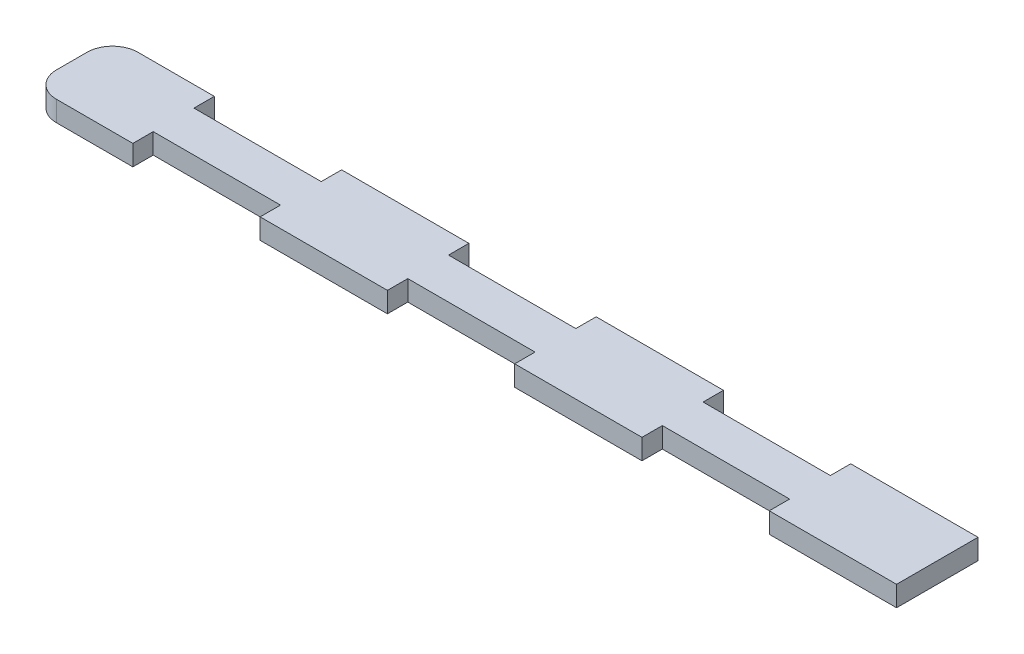
ISO-10303-21;
HEADER;
FILE_DESCRIPTION(('STEP AP214'),'2;1');
FILE_NAME('part.step','',(''),(''),'','','');
FILE_SCHEMA(('AUTOMOTIVE_DESIGN { 1 0 10303 214 1 1 1 1 }'));
ENDSEC;
DATA;
#1=APPLICATION_CONTEXT('core data for automotive mechanical design processes');
#2=APPLICATION_PROTOCOL_DEFINITION('international standard','automotive_design',2000,#1);
#3=PRODUCT_CONTEXT('',#1,'mechanical');
#4=PRODUCT('Part','Part','',(#3));
#5=PRODUCT_RELATED_PRODUCT_CATEGORY('part','',(#4));
#6=PRODUCT_DEFINITION_FORMATION('','',#4);
#7=PRODUCT_DEFINITION_CONTEXT('part definition',#1,'design');
#8=PRODUCT_DEFINITION('design','',#6,#7);
#9=PRODUCT_DEFINITION_SHAPE('','',#8);
#10=(LENGTH_UNIT() NAMED_UNIT(*) SI_UNIT(.MILLI.,.METRE.));
#11=(NAMED_UNIT(*) PLANE_ANGLE_UNIT() SI_UNIT($,.RADIAN.));
#12=(NAMED_UNIT(*) SI_UNIT($,.STERADIAN.) SOLID_ANGLE_UNIT());
#13=UNCERTAINTY_MEASURE_WITH_UNIT(LENGTH_MEASURE(1.E-05),#10,'distance_accuracy_value','');
#14=(GEOMETRIC_REPRESENTATION_CONTEXT(3) GLOBAL_UNCERTAINTY_ASSIGNED_CONTEXT((#13)) GLOBAL_UNIT_ASSIGNED_CONTEXT((#10,
#11,#12)) REPRESENTATION_CONTEXT('',''));
#15=CARTESIAN_POINT('',(0.,0.,0.));
#16=DIRECTION('',(0.,0.,1.));
#17=DIRECTION('',(1.,0.,0.));
#18=AXIS2_PLACEMENT_3D('',#15,#16,#17);
#19=CARTESIAN_POINT('',(-85.,2.,8.));
#20=DIRECTION('',(0.,0.,-1.));
#21=DIRECTION('',(-1.,0.,0.));
#22=AXIS2_PLACEMENT_3D('',#19,#20,#21);
#23=PLANE('',#22);
#24=DIRECTION('',(0.,1.,0.));
#25=VECTOR('',#24,1.);
#26=CARTESIAN_POINT('',(60.,-2.,8.));
#27=LINE('',#26,#25);
#28=CARTESIAN_POINT('',(60.,-2.,8.));
#29=VERTEX_POINT('',#28);
#30=CARTESIAN_POINT('',(60.,2.,8.));
#31=VERTEX_POINT('',#30);
#32=EDGE_CURVE('E277',#29,#31,#27,.T.);
#33=ORIENTED_EDGE('',*,*,#32,.F.);
#34=DIRECTION('',(1.,0.,0.));
#35=VECTOR('',#34,1.);
#36=CARTESIAN_POINT('',(-85.,-2.,8.));
#37=LINE('',#36,#35);
#38=CARTESIAN_POINT('',(85.,-2.,8.));
#39=VERTEX_POINT('',#38);
#40=EDGE_CURVE('E266',#29,#39,#37,.T.);
#41=ORIENTED_EDGE('',*,*,#40,.T.);
#42=DIRECTION('',(0.,-1.,0.));
#43=VECTOR('',#42,1.);
#44=CARTESIAN_POINT('',(85.,2.,8.));
#45=LINE('',#44,#43);
#46=CARTESIAN_POINT('',(85.,2.,8.));
#47=VERTEX_POINT('',#46);
#48=EDGE_CURVE('E425',#47,#39,#45,.T.);
#49=ORIENTED_EDGE('',*,*,#48,.F.);
#50=DIRECTION('',(1.,0.,0.));
#51=VECTOR('',#50,1.);
#52=CARTESIAN_POINT('',(-85.,2.,8.));
#53=LINE('',#52,#51);
#54=EDGE_CURVE('E422',#31,#47,#53,.T.);
#55=ORIENTED_EDGE('',*,*,#54,.F.);
#56=EDGE_LOOP('',(#33,#41,#49,#55));
#57=FACE_BOUND('',#56,.T.);
#58=ADVANCED_FACE('F42',(#57),#23,.F.);
#59=DIRECTION('',(0.,1.,0.));
#60=VECTOR('',#59,1.);
#61=CARTESIAN_POINT('',(35.,-2.,8.));
#62=LINE('',#61,#60);
#63=CARTESIAN_POINT('',(35.,-2.,8.));
#64=VERTEX_POINT('',#63);
#65=CARTESIAN_POINT('',(35.,2.,8.));
#66=VERTEX_POINT('',#65);
#67=EDGE_CURVE('E280',#64,#66,#62,.T.);
#68=ORIENTED_EDGE('',*,*,#67,.T.);
#69=CARTESIAN_POINT('',(10.,2.,7.99999999999965));
#70=VERTEX_POINT('',#69);
#71=EDGE_CURVE('E568',#70,#66,#53,.T.);
#72=ORIENTED_EDGE('',*,*,#71,.F.);
#73=DIRECTION('',(0.,1.,0.));
#74=VECTOR('',#73,1.);
#75=CARTESIAN_POINT('',(10.,-2.,7.99999999999965));
#76=LINE('',#75,#74);
#77=CARTESIAN_POINT('',(10.,-2.,7.99999999999965));
#78=VERTEX_POINT('',#77);
#79=EDGE_CURVE('E292',#78,#70,#76,.T.);
#80=ORIENTED_EDGE('',*,*,#79,.F.);
#81=EDGE_CURVE('E554',#78,#64,#37,.T.);
#82=ORIENTED_EDGE('',*,*,#81,.T.);
#83=EDGE_LOOP('',(#68,#72,#80,#82));
#84=FACE_BOUND('',#83,.T.);
#85=ADVANCED_FACE('F511',(#84),#23,.F.);
#86=DIRECTION('',(0.,1.,0.));
#87=VECTOR('',#86,1.);
#88=CARTESIAN_POINT('',(-15.,-2.,7.99999999999965));
#89=LINE('',#88,#87);
#90=CARTESIAN_POINT('',(-15.,-2.,7.99999999999965));
#91=VERTEX_POINT('',#90);
#92=CARTESIAN_POINT('',(-15.,2.,7.99999999999965));
#93=VERTEX_POINT('',#92);
#94=EDGE_CURVE('E275',#91,#93,#89,.T.);
#95=ORIENTED_EDGE('',*,*,#94,.T.);
#96=CARTESIAN_POINT('',(-40.,2.,7.9999999999993));
#97=VERTEX_POINT('',#96);
#98=EDGE_CURVE('E426',#97,#93,#53,.T.);
#99=ORIENTED_EDGE('',*,*,#98,.F.);
#100=DIRECTION('',(0.,1.,0.));
#101=VECTOR('',#100,1.);
#102=CARTESIAN_POINT('',(-40.,-2.,7.9999999999993));
#103=LINE('',#102,#101);
#104=CARTESIAN_POINT('',(-40.,-2.,7.9999999999993));
#105=VERTEX_POINT('',#104);
#106=EDGE_CURVE('E317',#105,#97,#103,.T.);
#107=ORIENTED_EDGE('',*,*,#106,.F.);
#108=EDGE_CURVE('E438',#105,#91,#37,.T.);
#109=ORIENTED_EDGE('',*,*,#108,.T.);
#110=EDGE_LOOP('',(#95,#99,#107,#109));
#111=FACE_BOUND('',#110,.T.);
#112=ADVANCED_FACE('F518',(#111),#23,.F.);
#113=CARTESIAN_POINT('',(-80.,2.,8.));
#114=VERTEX_POINT('',#113);
#115=CARTESIAN_POINT('',(-65.,2.,7.9999999999993));
#116=VERTEX_POINT('',#115);
#117=EDGE_CURVE('E423',#114,#116,#53,.T.);
#118=ORIENTED_EDGE('',*,*,#117,.F.);
#119=DIRECTION('',(0.,-1.,0.));
#120=VECTOR('',#119,1.);
#121=CARTESIAN_POINT('',(-80.,2.,8.));
#122=LINE('',#121,#120);
#123=CARTESIAN_POINT('',(-80.,-2.,8.));
#124=VERTEX_POINT('',#123);
#125=EDGE_CURVE('E11',#114,#124,#122,.T.);
#126=ORIENTED_EDGE('',*,*,#125,.T.);
#127=CARTESIAN_POINT('',(-65.,-2.,7.9999999999993));
#128=VERTEX_POINT('',#127);
#129=EDGE_CURVE('E415',#124,#128,#37,.T.);
#130=ORIENTED_EDGE('',*,*,#129,.T.);
#131=DIRECTION('',(0.,1.,0.));
#132=VECTOR('',#131,1.);
#133=CARTESIAN_POINT('',(-65.,-2.,7.9999999999993));
#134=LINE('',#133,#132);
#135=EDGE_CURVE('E297',#128,#116,#134,.T.);
#136=ORIENTED_EDGE('',*,*,#135,.T.);
#137=EDGE_LOOP('',(#118,#126,#130,#136));
#138=FACE_BOUND('',#137,.T.);
#139=ADVANCED_FACE('F514',(#138),#23,.F.);
#140=CARTESIAN_POINT('',(0.,2.,0.));
#141=DIRECTION('',(0.,-1.,0.));
#142=DIRECTION('',(0.,0.,-1.));
#143=AXIS2_PLACEMENT_3D('',#140,#141,#142);
#144=PLANE('',#143);
#145=DIRECTION('',(-1.,0.,0.));
#146=VECTOR('',#145,1.);
#147=CARTESIAN_POINT('',(-85.,2.,-8.));
#148=LINE('',#147,#146);
#149=CARTESIAN_POINT('',(-65.,2.,-7.9999999999993));
#150=VERTEX_POINT('',#149);
#151=CARTESIAN_POINT('',(-80.,2.,-8.));
#152=VERTEX_POINT('',#151);
#153=EDGE_CURVE('E414',#150,#152,#148,.T.);
#154=ORIENTED_EDGE('',*,*,#153,.T.);
#155=CARTESIAN_POINT('',(-80.,2.,-3.));
#156=DIRECTION('',(0.,-1.,0.));
#157=DIRECTION('',(0.,0.,-1.));
#158=AXIS2_PLACEMENT_3D('',#155,#156,#157);
#159=CIRCLE('',#158,5.);
#160=CARTESIAN_POINT('',(-85.,2.,-3.));
#161=VERTEX_POINT('',#160);
#162=EDGE_CURVE('E50',#152,#161,#159,.F.);
#163=ORIENTED_EDGE('',*,*,#162,.T.);
#164=DIRECTION('',(0.,0.,1.));
#165=VECTOR('',#164,1.);
#166=CARTESIAN_POINT('',(-85.,2.,8.));
#167=LINE('',#166,#165);
#168=CARTESIAN_POINT('',(-85.,2.,3.));
#169=VERTEX_POINT('',#168);
#170=EDGE_CURVE('E419',#161,#169,#167,.T.);
#171=ORIENTED_EDGE('',*,*,#170,.T.);
#172=CARTESIAN_POINT('',(-80.,2.,3.));
#173=DIRECTION('',(0.,-1.,0.));
#174=DIRECTION('',(0.,0.,-1.));
#175=AXIS2_PLACEMENT_3D('',#172,#173,#174);
#176=CIRCLE('',#175,5.);
#177=EDGE_CURVE('E57',#169,#114,#176,.F.);
#178=ORIENTED_EDGE('',*,*,#177,.T.);
#179=ORIENTED_EDGE('',*,*,#117,.T.);
#180=DIRECTION('',(0.,0.,-1.));
#181=VECTOR('',#180,1.);
#182=CARTESIAN_POINT('',(-65.,2.,7.9999999999993));
#183=LINE('',#182,#181);
#184=CARTESIAN_POINT('',(-65.,2.,3.9999999999993));
#185=VERTEX_POINT('',#184);
#186=EDGE_CURVE('E312',#116,#185,#183,.T.);
#187=ORIENTED_EDGE('',*,*,#186,.T.);
#188=DIRECTION('',(1.,0.,0.));
#189=VECTOR('',#188,1.);
#190=CARTESIAN_POINT('',(-40.,2.,3.9999999999993));
#191=LINE('',#190,#189);
#192=CARTESIAN_POINT('',(-40.,2.,3.9999999999993));
#193=VERTEX_POINT('',#192);
#194=EDGE_CURVE('E321',#185,#193,#191,.T.);
#195=ORIENTED_EDGE('',*,*,#194,.T.);
#196=DIRECTION('',(0.,0.,1.));
#197=VECTOR('',#196,1.);
#198=CARTESIAN_POINT('',(-40.,2.,7.9999999999993));
#199=LINE('',#198,#197);
#200=EDGE_CURVE('E318',#193,#97,#199,.T.);
#201=ORIENTED_EDGE('',*,*,#200,.T.);
#202=ORIENTED_EDGE('',*,*,#98,.T.);
#203=DIRECTION('',(0.,0.,-1.));
#204=VECTOR('',#203,1.);
#205=CARTESIAN_POINT('',(-15.,2.,7.99999999999965));
#206=LINE('',#205,#204);
#207=CARTESIAN_POINT('',(-15.,2.,3.99999999999965));
#208=VERTEX_POINT('',#207);
#209=EDGE_CURVE('E287',#93,#208,#206,.T.);
#210=ORIENTED_EDGE('',*,*,#209,.T.);
#211=DIRECTION('',(1.,0.,0.));
#212=VECTOR('',#211,1.);
#213=CARTESIAN_POINT('',(10.,2.,3.99999999999965));
#214=LINE('',#213,#212);
#215=CARTESIAN_POINT('',(10.,2.,3.99999999999965));
#216=VERTEX_POINT('',#215);
#217=EDGE_CURVE('E296',#208,#216,#214,.T.);
#218=ORIENTED_EDGE('',*,*,#217,.T.);
#219=DIRECTION('',(0.,0.,1.));
#220=VECTOR('',#219,1.);
#221=CARTESIAN_POINT('',(10.,2.,7.99999999999965));
#222=LINE('',#221,#220);
#223=EDGE_CURVE('E293',#216,#70,#222,.T.);
#224=ORIENTED_EDGE('',*,*,#223,.T.);
#225=ORIENTED_EDGE('',*,*,#71,.T.);
#226=DIRECTION('',(0.,0.,-1.));
#227=VECTOR('',#226,1.);
#228=CARTESIAN_POINT('',(35.,2.,8.));
#229=LINE('',#228,#227);
#230=CARTESIAN_POINT('',(35.,2.,4.));
#231=VERTEX_POINT('',#230);
#232=EDGE_CURVE('E267',#66,#231,#229,.T.);
#233=ORIENTED_EDGE('',*,*,#232,.T.);
#234=DIRECTION('',(1.,0.,0.));
#235=VECTOR('',#234,1.);
#236=CARTESIAN_POINT('',(60.,2.,4.));
#237=LINE('',#236,#235);
#238=CARTESIAN_POINT('',(60.,2.,4.));
#239=VERTEX_POINT('',#238);
#240=EDGE_CURVE('E270',#231,#239,#237,.T.);
#241=ORIENTED_EDGE('',*,*,#240,.T.);
#242=DIRECTION('',(0.,0.,1.));
#243=VECTOR('',#242,1.);
#244=CARTESIAN_POINT('',(60.,2.,8.));
#245=LINE('',#244,#243);
#246=EDGE_CURVE('E259',#239,#31,#245,.T.);
#247=ORIENTED_EDGE('',*,*,#246,.T.);
#248=ORIENTED_EDGE('',*,*,#54,.T.);
#249=DIRECTION('',(0.,0.,-1.));
#250=VECTOR('',#249,1.);
#251=CARTESIAN_POINT('',(85.,2.,8.));
#252=LINE('',#251,#250);
#253=CARTESIAN_POINT('',(85.,2.,-8.));
#254=VERTEX_POINT('',#253);
#255=EDGE_CURVE('E411',#47,#254,#252,.T.);
#256=ORIENTED_EDGE('',*,*,#255,.T.);
#257=CARTESIAN_POINT('',(60.,2.,-8.));
#258=VERTEX_POINT('',#257);
#259=EDGE_CURVE('E416',#254,#258,#148,.T.);
#260=ORIENTED_EDGE('',*,*,#259,.T.);
#261=DIRECTION('',(0.,0.,-1.));
#262=VECTOR('',#261,1.);
#263=CARTESIAN_POINT('',(60.,2.,-8.));
#264=LINE('',#263,#262);
#265=CARTESIAN_POINT('',(60.,2.,-4.));
#266=VERTEX_POINT('',#265);
#267=EDGE_CURVE('E344',#266,#258,#264,.T.);
#268=ORIENTED_EDGE('',*,*,#267,.F.);
#269=DIRECTION('',(1.,0.,0.));
#270=VECTOR('',#269,1.);
#271=CARTESIAN_POINT('',(60.,2.,-4.));
#272=LINE('',#271,#270);
#273=CARTESIAN_POINT('',(35.,2.,-4.));
#274=VERTEX_POINT('',#273);
#275=EDGE_CURVE('E337',#274,#266,#272,.T.);
#276=ORIENTED_EDGE('',*,*,#275,.F.);
#277=DIRECTION('',(0.,0.,1.));
#278=VECTOR('',#277,1.);
#279=CARTESIAN_POINT('',(35.,2.,-8.));
#280=LINE('',#279,#278);
#281=CARTESIAN_POINT('',(35.,2.,-8.));
#282=VERTEX_POINT('',#281);
#283=EDGE_CURVE('E346',#282,#274,#280,.T.);
#284=ORIENTED_EDGE('',*,*,#283,.F.);
#285=CARTESIAN_POINT('',(10.,2.,-7.99999999999965));
#286=VERTEX_POINT('',#285);
#287=EDGE_CURVE('E420',#282,#286,#148,.T.);
#288=ORIENTED_EDGE('',*,*,#287,.T.);
#289=DIRECTION('',(0.,0.,-1.));
#290=VECTOR('',#289,1.);
#291=CARTESIAN_POINT('',(10.,2.,-7.99999999999965));
#292=LINE('',#291,#290);
#293=CARTESIAN_POINT('',(10.,2.,-3.99999999999965));
#294=VERTEX_POINT('',#293);
#295=EDGE_CURVE('E372',#294,#286,#292,.T.);
#296=ORIENTED_EDGE('',*,*,#295,.F.);
#297=DIRECTION('',(1.,0.,0.));
#298=VECTOR('',#297,1.);
#299=CARTESIAN_POINT('',(10.,2.,-3.99999999999965));
#300=LINE('',#299,#298);
#301=CARTESIAN_POINT('',(-15.,2.,-3.99999999999965));
#302=VERTEX_POINT('',#301);
#303=EDGE_CURVE('E374',#302,#294,#300,.T.);
#304=ORIENTED_EDGE('',*,*,#303,.F.);
#305=DIRECTION('',(0.,0.,1.));
#306=VECTOR('',#305,1.);
#307=CARTESIAN_POINT('',(-15.,2.,-7.99999999999965));
#308=LINE('',#307,#306);
#309=CARTESIAN_POINT('',(-15.,2.,-7.99999999999965));
#310=VERTEX_POINT('',#309);
#311=EDGE_CURVE('E347',#310,#302,#308,.T.);
#312=ORIENTED_EDGE('',*,*,#311,.F.);
#313=CARTESIAN_POINT('',(-40.,2.,-7.9999999999993));
#314=VERTEX_POINT('',#313);
#315=EDGE_CURVE('E487',#310,#314,#148,.T.);
#316=ORIENTED_EDGE('',*,*,#315,.T.);
#317=DIRECTION('',(0.,0.,-1.));
#318=VECTOR('',#317,1.);
#319=CARTESIAN_POINT('',(-40.,2.,-7.9999999999993));
#320=LINE('',#319,#318);
#321=CARTESIAN_POINT('',(-40.,2.,-3.9999999999993));
#322=VERTEX_POINT('',#321);
#323=EDGE_CURVE('E396',#322,#314,#320,.T.);
#324=ORIENTED_EDGE('',*,*,#323,.F.);
#325=DIRECTION('',(1.,0.,0.));
#326=VECTOR('',#325,1.);
#327=CARTESIAN_POINT('',(-40.,2.,-3.9999999999993));
#328=LINE('',#327,#326);
#329=CARTESIAN_POINT('',(-65.,2.,-3.9999999999993));
#330=VERTEX_POINT('',#329);
#331=EDGE_CURVE('E398',#330,#322,#328,.T.);
#332=ORIENTED_EDGE('',*,*,#331,.F.);
#333=DIRECTION('',(0.,0.,1.));
#334=VECTOR('',#333,1.);
#335=CARTESIAN_POINT('',(-65.,2.,-7.9999999999993));
#336=LINE('',#335,#334);
#337=EDGE_CURVE('E371',#150,#330,#336,.T.);
#338=ORIENTED_EDGE('',*,*,#337,.F.);
#339=EDGE_LOOP('',(#154,#163,#171,#178,#179,#187,#195,#201,#202,#210,#218,#224,#225,#233,#241,
#247,#248,#256,#260,#268,#276,#284,#288,#296,#304,#312,#316,#324,#332,#338));
#340=FACE_BOUND('',#339,.T.);
#341=ADVANCED_FACE('F456',(#340),#144,.F.);
#342=CARTESIAN_POINT('',(0.,-2.,0.));
#343=DIRECTION('',(0.,-1.,0.));
#344=DIRECTION('',(0.,0.,-1.));
#345=AXIS2_PLACEMENT_3D('',#342,#343,#344);
#346=PLANE('',#345);
#347=DIRECTION('',(0.,0.,1.));
#348=VECTOR('',#347,1.);
#349=CARTESIAN_POINT('',(-85.,-2.,8.));
#350=LINE('',#349,#348);
#351=CARTESIAN_POINT('',(-85.,-2.,-3.));
#352=VERTEX_POINT('',#351);
#353=CARTESIAN_POINT('',(-85.,-2.,3.));
#354=VERTEX_POINT('',#353);
#355=EDGE_CURVE('E433',#352,#354,#350,.T.);
#356=ORIENTED_EDGE('',*,*,#355,.F.);
#357=CARTESIAN_POINT('',(-80.,-2.,-3.));
#358=DIRECTION('',(0.,-1.,0.));
#359=DIRECTION('',(0.,0.,-1.));
#360=AXIS2_PLACEMENT_3D('',#357,#358,#359);
#361=CIRCLE('',#360,5.);
#362=CARTESIAN_POINT('',(-80.,-2.,-8.));
#363=VERTEX_POINT('',#362);
#364=EDGE_CURVE('E451',#352,#363,#361,.T.);
#365=ORIENTED_EDGE('',*,*,#364,.T.);
#366=DIRECTION('',(-1.,0.,0.));
#367=VECTOR('',#366,1.);
#368=CARTESIAN_POINT('',(-85.,-2.,-8.));
#369=LINE('',#368,#367);
#370=CARTESIAN_POINT('',(-65.,-2.,-7.9999999999993));
#371=VERTEX_POINT('',#370);
#372=EDGE_CURVE('E429',#371,#363,#369,.T.);
#373=ORIENTED_EDGE('',*,*,#372,.F.);
#374=DIRECTION('',(0.,0.,1.));
#375=VECTOR('',#374,1.);
#376=CARTESIAN_POINT('',(-65.,-2.,-7.9999999999993));
#377=LINE('',#376,#375);
#378=CARTESIAN_POINT('',(-65.,-2.,-3.9999999999993));
#379=VERTEX_POINT('',#378);
#380=EDGE_CURVE('E399',#371,#379,#377,.T.);
#381=ORIENTED_EDGE('',*,*,#380,.T.);
#382=DIRECTION('',(1.,0.,0.));
#383=VECTOR('',#382,1.);
#384=CARTESIAN_POINT('',(-40.,-2.,-3.9999999999993));
#385=LINE('',#384,#383);
#386=CARTESIAN_POINT('',(-40.,-2.,-3.9999999999993));
#387=VERTEX_POINT('',#386);
#388=EDGE_CURVE('E406',#379,#387,#385,.T.);
#389=ORIENTED_EDGE('',*,*,#388,.T.);
#390=DIRECTION('',(0.,0.,-1.));
#391=VECTOR('',#390,1.);
#392=CARTESIAN_POINT('',(-40.,-2.,-7.9999999999993));
#393=LINE('',#392,#391);
#394=CARTESIAN_POINT('',(-40.,-2.,-7.9999999999993));
#395=VERTEX_POINT('',#394);
#396=EDGE_CURVE('E389',#387,#395,#393,.T.);
#397=ORIENTED_EDGE('',*,*,#396,.T.);
#398=CARTESIAN_POINT('',(-15.,-2.,-7.99999999999965));
#399=VERTEX_POINT('',#398);
#400=EDGE_CURVE('E467',#399,#395,#369,.T.);
#401=ORIENTED_EDGE('',*,*,#400,.F.);
#402=DIRECTION('',(0.,0.,1.));
#403=VECTOR('',#402,1.);
#404=CARTESIAN_POINT('',(-15.,-2.,-7.99999999999965));
#405=LINE('',#404,#403);
#406=CARTESIAN_POINT('',(-15.,-2.,-3.99999999999965));
#407=VERTEX_POINT('',#406);
#408=EDGE_CURVE('E375',#399,#407,#405,.T.);
#409=ORIENTED_EDGE('',*,*,#408,.T.);
#410=DIRECTION('',(1.,0.,0.));
#411=VECTOR('',#410,1.);
#412=CARTESIAN_POINT('',(10.,-2.,-3.99999999999965));
#413=LINE('',#412,#411);
#414=CARTESIAN_POINT('',(10.,-2.,-3.99999999999965));
#415=VERTEX_POINT('',#414);
#416=EDGE_CURVE('E382',#407,#415,#413,.T.);
#417=ORIENTED_EDGE('',*,*,#416,.T.);
#418=DIRECTION('',(0.,0.,-1.));
#419=VECTOR('',#418,1.);
#420=CARTESIAN_POINT('',(10.,-2.,-7.99999999999965));
#421=LINE('',#420,#419);
#422=CARTESIAN_POINT('',(10.,-2.,-7.99999999999965));
#423=VERTEX_POINT('',#422);
#424=EDGE_CURVE('E363',#415,#423,#421,.T.);
#425=ORIENTED_EDGE('',*,*,#424,.T.);
#426=CARTESIAN_POINT('',(35.,-2.,-8.));
#427=VERTEX_POINT('',#426);
#428=EDGE_CURVE('E434',#427,#423,#369,.T.);
#429=ORIENTED_EDGE('',*,*,#428,.F.);
#430=DIRECTION('',(0.,0.,1.));
#431=VECTOR('',#430,1.);
#432=CARTESIAN_POINT('',(35.,-2.,-8.));
#433=LINE('',#432,#431);
#434=CARTESIAN_POINT('',(35.,-2.,-4.));
#435=VERTEX_POINT('',#434);
#436=EDGE_CURVE('E336',#427,#435,#433,.T.);
#437=ORIENTED_EDGE('',*,*,#436,.T.);
#438=DIRECTION('',(1.,0.,0.));
#439=VECTOR('',#438,1.);
#440=CARTESIAN_POINT('',(60.,-2.,-4.));
#441=LINE('',#440,#439);
#442=CARTESIAN_POINT('',(60.,-2.,-4.));
#443=VERTEX_POINT('',#442);
#444=EDGE_CURVE('E340',#435,#443,#441,.T.);
#445=ORIENTED_EDGE('',*,*,#444,.T.);
#446=DIRECTION('',(0.,0.,-1.));
#447=VECTOR('',#446,1.);
#448=CARTESIAN_POINT('',(60.,-2.,-8.));
#449=LINE('',#448,#447);
#450=CARTESIAN_POINT('',(60.,-2.,-8.));
#451=VERTEX_POINT('',#450);
#452=EDGE_CURVE('E333',#443,#451,#449,.T.);
#453=ORIENTED_EDGE('',*,*,#452,.T.);
#454=CARTESIAN_POINT('',(85.,-2.,-8.));
#455=VERTEX_POINT('',#454);
#456=EDGE_CURVE('E430',#455,#451,#369,.T.);
#457=ORIENTED_EDGE('',*,*,#456,.F.);
#458=DIRECTION('',(0.,0.,-1.));
#459=VECTOR('',#458,1.);
#460=CARTESIAN_POINT('',(85.,-2.,8.));
#461=LINE('',#460,#459);
#462=EDGE_CURVE('E354',#39,#455,#461,.T.);
#463=ORIENTED_EDGE('',*,*,#462,.F.);
#464=ORIENTED_EDGE('',*,*,#40,.F.);
#465=DIRECTION('',(0.,0.,1.));
#466=VECTOR('',#465,1.);
#467=CARTESIAN_POINT('',(60.,-2.,8.));
#468=LINE('',#467,#466);
#469=CARTESIAN_POINT('',(60.,-2.,4.));
#470=VERTEX_POINT('',#469);
#471=EDGE_CURVE('E253',#470,#29,#468,.T.);
#472=ORIENTED_EDGE('',*,*,#471,.F.);
#473=DIRECTION('',(1.,0.,0.));
#474=VECTOR('',#473,1.);
#475=CARTESIAN_POINT('',(60.,-2.,4.));
#476=LINE('',#475,#474);
#477=CARTESIAN_POINT('',(35.,-2.,4.));
#478=VERTEX_POINT('',#477);
#479=EDGE_CURVE('E241',#478,#470,#476,.T.);
#480=ORIENTED_EDGE('',*,*,#479,.F.);
#481=DIRECTION('',(0.,0.,-1.));
#482=VECTOR('',#481,1.);
#483=CARTESIAN_POINT('',(35.,-2.,8.));
#484=LINE('',#483,#482);
#485=EDGE_CURVE('E252',#64,#478,#484,.T.);
#486=ORIENTED_EDGE('',*,*,#485,.F.);
#487=ORIENTED_EDGE('',*,*,#81,.F.);
#488=DIRECTION('',(0.,0.,1.));
#489=VECTOR('',#488,1.);
#490=CARTESIAN_POINT('',(10.,-2.,7.99999999999965));
#491=LINE('',#490,#489);
#492=CARTESIAN_POINT('',(10.,-2.,3.99999999999965));
#493=VERTEX_POINT('',#492);
#494=EDGE_CURVE('E284',#493,#78,#491,.T.);
#495=ORIENTED_EDGE('',*,*,#494,.F.);
#496=DIRECTION('',(1.,0.,0.));
#497=VECTOR('',#496,1.);
#498=CARTESIAN_POINT('',(10.,-2.,3.99999999999965));
#499=LINE('',#498,#497);
#500=CARTESIAN_POINT('',(-15.,-2.,3.99999999999965));
#501=VERTEX_POINT('',#500);
#502=EDGE_CURVE('E286',#501,#493,#499,.T.);
#503=ORIENTED_EDGE('',*,*,#502,.F.);
#504=DIRECTION('',(0.,0.,-1.));
#505=VECTOR('',#504,1.);
#506=CARTESIAN_POINT('',(-15.,-2.,7.99999999999965));
#507=LINE('',#506,#505);
#508=EDGE_CURVE('E290',#91,#501,#507,.T.);
#509=ORIENTED_EDGE('',*,*,#508,.F.);
#510=ORIENTED_EDGE('',*,*,#108,.F.);
#511=DIRECTION('',(0.,0.,1.));
#512=VECTOR('',#511,1.);
#513=CARTESIAN_POINT('',(-40.,-2.,7.9999999999993));
#514=LINE('',#513,#512);
#515=CARTESIAN_POINT('',(-40.,-2.,3.9999999999993));
#516=VERTEX_POINT('',#515);
#517=EDGE_CURVE('E309',#516,#105,#514,.T.);
#518=ORIENTED_EDGE('',*,*,#517,.F.);
#519=DIRECTION('',(1.,0.,0.));
#520=VECTOR('',#519,1.);
#521=CARTESIAN_POINT('',(-40.,-2.,3.9999999999993));
#522=LINE('',#521,#520);
#523=CARTESIAN_POINT('',(-65.,-2.,3.9999999999993));
#524=VERTEX_POINT('',#523);
#525=EDGE_CURVE('E311',#524,#516,#522,.T.);
#526=ORIENTED_EDGE('',*,*,#525,.F.);
#527=DIRECTION('',(0.,0.,-1.));
#528=VECTOR('',#527,1.);
#529=CARTESIAN_POINT('',(-65.,-2.,7.9999999999993));
#530=LINE('',#529,#528);
#531=EDGE_CURVE('E315',#128,#524,#530,.T.);
#532=ORIENTED_EDGE('',*,*,#531,.F.);
#533=ORIENTED_EDGE('',*,*,#129,.F.);
#534=CARTESIAN_POINT('',(-80.,-2.,3.));
#535=DIRECTION('',(0.,-1.,0.));
#536=DIRECTION('',(0.,0.,-1.));
#537=AXIS2_PLACEMENT_3D('',#534,#535,#536);
#538=CIRCLE('',#537,5.);
#539=EDGE_CURVE('E449',#124,#354,#538,.T.);
#540=ORIENTED_EDGE('',*,*,#539,.T.);
#541=EDGE_LOOP('',(#356,#365,#373,#381,#389,#397,#401,#409,#417,#425,#429,#437,#445,#453,#457,
#463,#464,#472,#480,#486,#487,#495,#503,#509,#510,#518,#526,#532,#533,#540));
#542=FACE_BOUND('',#541,.T.);
#543=ADVANCED_FACE('F264',(#542),#346,.T.);
#544=CARTESIAN_POINT('',(-85.,2.,-8.));
#545=DIRECTION('',(0.,0.,1.));
#546=DIRECTION('',(1.,0.,0.));
#547=AXIS2_PLACEMENT_3D('',#544,#545,#546);
#548=PLANE('',#547);
#549=ORIENTED_EDGE('',*,*,#456,.T.);
#550=DIRECTION('',(0.,1.,0.));
#551=VECTOR('',#550,1.);
#552=CARTESIAN_POINT('',(60.,-2.,-8.));
#553=LINE('',#552,#551);
#554=EDGE_CURVE('E343',#451,#258,#553,.T.);
#555=ORIENTED_EDGE('',*,*,#554,.T.);
#556=ORIENTED_EDGE('',*,*,#259,.F.);
#557=DIRECTION('',(0.,-1.,0.));
#558=VECTOR('',#557,1.);
#559=CARTESIAN_POINT('',(85.,2.,-8.));
#560=LINE('',#559,#558);
#561=EDGE_CURVE('E441',#254,#455,#560,.T.);
#562=ORIENTED_EDGE('',*,*,#561,.T.);
#563=EDGE_LOOP('',(#549,#555,#556,#562));
#564=FACE_BOUND('',#563,.T.);
#565=ADVANCED_FACE('F566',(#564),#548,.F.);
#566=ORIENTED_EDGE('',*,*,#287,.F.);
#567=DIRECTION('',(0.,1.,0.));
#568=VECTOR('',#567,1.);
#569=CARTESIAN_POINT('',(35.,-2.,-8.));
#570=LINE('',#569,#568);
#571=EDGE_CURVE('E357',#427,#282,#570,.T.);
#572=ORIENTED_EDGE('',*,*,#571,.F.);
#573=ORIENTED_EDGE('',*,*,#428,.T.);
#574=DIRECTION('',(0.,1.,0.));
#575=VECTOR('',#574,1.);
#576=CARTESIAN_POINT('',(10.,-2.,-7.99999999999965));
#577=LINE('',#576,#575);
#578=EDGE_CURVE('E368',#423,#286,#577,.T.);
#579=ORIENTED_EDGE('',*,*,#578,.T.);
#580=EDGE_LOOP('',(#566,#572,#573,#579));
#581=FACE_BOUND('',#580,.T.);
#582=ADVANCED_FACE('F477',(#581),#548,.F.);
#583=ORIENTED_EDGE('',*,*,#315,.F.);
#584=DIRECTION('',(0.,1.,0.));
#585=VECTOR('',#584,1.);
#586=CARTESIAN_POINT('',(-15.,-2.,-7.99999999999965));
#587=LINE('',#586,#585);
#588=EDGE_CURVE('E361',#399,#310,#587,.T.);
#589=ORIENTED_EDGE('',*,*,#588,.F.);
#590=ORIENTED_EDGE('',*,*,#400,.T.);
#591=DIRECTION('',(0.,1.,0.));
#592=VECTOR('',#591,1.);
#593=CARTESIAN_POINT('',(-40.,-2.,-7.9999999999993));
#594=LINE('',#593,#592);
#595=EDGE_CURVE('E279',#395,#314,#594,.T.);
#596=ORIENTED_EDGE('',*,*,#595,.T.);
#597=EDGE_LOOP('',(#583,#589,#590,#596));
#598=FACE_BOUND('',#597,.T.);
#599=ADVANCED_FACE('F492',(#598),#548,.F.);
#600=CARTESIAN_POINT('',(85.,2.,8.));
#601=DIRECTION('',(-1.,0.,0.));
#602=DIRECTION('',(0.,0.,1.));
#603=AXIS2_PLACEMENT_3D('',#600,#601,#602);
#604=PLANE('',#603);
#605=ORIENTED_EDGE('',*,*,#462,.T.);
#606=ORIENTED_EDGE('',*,*,#561,.F.);
#607=ORIENTED_EDGE('',*,*,#255,.F.);
#608=ORIENTED_EDGE('',*,*,#48,.T.);
#609=EDGE_LOOP('',(#605,#606,#607,#608));
#610=FACE_BOUND('',#609,.T.);
#611=ADVANCED_FACE('F562',(#610),#604,.F.);
#612=ORIENTED_EDGE('',*,*,#372,.T.);
#613=DIRECTION('',(0.,-1.,0.));
#614=VECTOR('',#613,1.);
#615=CARTESIAN_POINT('',(-80.,2.,-8.));
#616=LINE('',#615,#614);
#617=EDGE_CURVE('E65',#363,#152,#616,.F.);
#618=ORIENTED_EDGE('',*,*,#617,.T.);
#619=ORIENTED_EDGE('',*,*,#153,.F.);
#620=DIRECTION('',(0.,1.,0.));
#621=VECTOR('',#620,1.);
#622=CARTESIAN_POINT('',(-65.,-2.,-7.9999999999993));
#623=LINE('',#622,#621);
#624=EDGE_CURVE('E387',#371,#150,#623,.T.);
#625=ORIENTED_EDGE('',*,*,#624,.F.);
#626=EDGE_LOOP('',(#612,#618,#619,#625));
#627=FACE_BOUND('',#626,.T.);
#628=ADVANCED_FACE('F466',(#627),#548,.F.);
#629=CARTESIAN_POINT('',(-85.,2.,8.));
#630=DIRECTION('',(1.,0.,0.));
#631=DIRECTION('',(0.,0.,-1.));
#632=AXIS2_PLACEMENT_3D('',#629,#630,#631);
#633=PLANE('',#632);
#634=ORIENTED_EDGE('',*,*,#170,.F.);
#635=DIRECTION('',(0.,-1.,0.));
#636=VECTOR('',#635,1.);
#637=CARTESIAN_POINT('',(-85.,2.,-3.));
#638=LINE('',#637,#636);
#639=EDGE_CURVE('E446',#161,#352,#638,.T.);
#640=ORIENTED_EDGE('',*,*,#639,.T.);
#641=ORIENTED_EDGE('',*,*,#355,.T.);
#642=DIRECTION('',(0.,-1.,0.));
#643=VECTOR('',#642,1.);
#644=CARTESIAN_POINT('',(-85.,2.,3.));
#645=LINE('',#644,#643);
#646=EDGE_CURVE('E444',#354,#169,#645,.F.);
#647=ORIENTED_EDGE('',*,*,#646,.T.);
#648=EDGE_LOOP('',(#634,#640,#641,#647));
#649=FACE_BOUND('',#648,.T.);
#650=ADVANCED_FACE('F461',(#649),#633,.F.);
#651=CARTESIAN_POINT('',(-40.,-2.,-7.9999999999993));
#652=DIRECTION('',(1.,0.,0.));
#653=DIRECTION('',(0.,0.,-1.));
#654=AXIS2_PLACEMENT_3D('',#651,#652,#653);
#655=PLANE('',#654);
#656=ORIENTED_EDGE('',*,*,#323,.T.);
#657=ORIENTED_EDGE('',*,*,#595,.F.);
#658=ORIENTED_EDGE('',*,*,#396,.F.);
#659=DIRECTION('',(0.,1.,0.));
#660=VECTOR('',#659,1.);
#661=CARTESIAN_POINT('',(-40.,-2.,-3.9999999999993));
#662=LINE('',#661,#660);
#663=EDGE_CURVE('E392',#387,#322,#662,.T.);
#664=ORIENTED_EDGE('',*,*,#663,.T.);
#665=EDGE_LOOP('',(#656,#657,#658,#664));
#666=FACE_BOUND('',#665,.T.);
#667=ADVANCED_FACE('F495',(#666),#655,.F.);
#668=CARTESIAN_POINT('',(-40.,-2.,-3.9999999999993));
#669=DIRECTION('',(0.,0.,1.));
#670=DIRECTION('',(1.,0.,0.));
#671=AXIS2_PLACEMENT_3D('',#668,#669,#670);
#672=PLANE('',#671);
#673=ORIENTED_EDGE('',*,*,#331,.T.);
#674=ORIENTED_EDGE('',*,*,#663,.F.);
#675=ORIENTED_EDGE('',*,*,#388,.F.);
#676=DIRECTION('',(0.,1.,0.));
#677=VECTOR('',#676,1.);
#678=CARTESIAN_POINT('',(-65.,-2.,-3.9999999999993));
#679=LINE('',#678,#677);
#680=EDGE_CURVE('E390',#379,#330,#679,.T.);
#681=ORIENTED_EDGE('',*,*,#680,.T.);
#682=EDGE_LOOP('',(#673,#674,#675,#681));
#683=FACE_BOUND('',#682,.T.);
#684=ADVANCED_FACE('F498',(#683),#672,.F.);
#685=CARTESIAN_POINT('',(-65.,-2.,-7.9999999999993));
#686=DIRECTION('',(-1.,0.,0.));
#687=DIRECTION('',(0.,0.,1.));
#688=AXIS2_PLACEMENT_3D('',#685,#686,#687);
#689=PLANE('',#688);
#690=ORIENTED_EDGE('',*,*,#337,.T.);
#691=ORIENTED_EDGE('',*,*,#680,.F.);
#692=ORIENTED_EDGE('',*,*,#380,.F.);
#693=ORIENTED_EDGE('',*,*,#624,.T.);
#694=EDGE_LOOP('',(#690,#691,#692,#693));
#695=FACE_BOUND('',#694,.T.);
#696=ADVANCED_FACE('F500',(#695),#689,.F.);
#697=CARTESIAN_POINT('',(10.,-2.,-7.99999999999965));
#698=DIRECTION('',(1.,0.,0.));
#699=DIRECTION('',(0.,0.,-1.));
#700=AXIS2_PLACEMENT_3D('',#697,#698,#699);
#701=PLANE('',#700);
#702=ORIENTED_EDGE('',*,*,#295,.T.);
#703=ORIENTED_EDGE('',*,*,#578,.F.);
#704=ORIENTED_EDGE('',*,*,#424,.F.);
#705=DIRECTION('',(0.,1.,0.));
#706=VECTOR('',#705,1.);
#707=CARTESIAN_POINT('',(10.,-2.,-3.99999999999965));
#708=LINE('',#707,#706);
#709=EDGE_CURVE('E366',#415,#294,#708,.T.);
#710=ORIENTED_EDGE('',*,*,#709,.T.);
#711=EDGE_LOOP('',(#702,#703,#704,#710));
#712=FACE_BOUND('',#711,.T.);
#713=ADVANCED_FACE('F481',(#712),#701,.F.);
#714=CARTESIAN_POINT('',(10.,-2.,-3.99999999999965));
#715=DIRECTION('',(0.,0.,1.));
#716=DIRECTION('',(1.,0.,0.));
#717=AXIS2_PLACEMENT_3D('',#714,#715,#716);
#718=PLANE('',#717);
#719=ORIENTED_EDGE('',*,*,#303,.T.);
#720=ORIENTED_EDGE('',*,*,#709,.F.);
#721=ORIENTED_EDGE('',*,*,#416,.F.);
#722=DIRECTION('',(0.,1.,0.));
#723=VECTOR('',#722,1.);
#724=CARTESIAN_POINT('',(-15.,-2.,-3.99999999999965));
#725=LINE('',#724,#723);
#726=EDGE_CURVE('E364',#407,#302,#725,.T.);
#727=ORIENTED_EDGE('',*,*,#726,.T.);
#728=EDGE_LOOP('',(#719,#720,#721,#727));
#729=FACE_BOUND('',#728,.T.);
#730=ADVANCED_FACE('F507',(#729),#718,.F.);
#731=CARTESIAN_POINT('',(-15.,-2.,-7.99999999999965));
#732=DIRECTION('',(-1.,0.,0.));
#733=DIRECTION('',(0.,0.,1.));
#734=AXIS2_PLACEMENT_3D('',#731,#732,#733);
#735=PLANE('',#734);
#736=ORIENTED_EDGE('',*,*,#311,.T.);
#737=ORIENTED_EDGE('',*,*,#726,.F.);
#738=ORIENTED_EDGE('',*,*,#408,.F.);
#739=ORIENTED_EDGE('',*,*,#588,.T.);
#740=EDGE_LOOP('',(#736,#737,#738,#739));
#741=FACE_BOUND('',#740,.T.);
#742=ADVANCED_FACE('F615',(#741),#735,.F.);
#743=CARTESIAN_POINT('',(60.,-2.,-8.));
#744=DIRECTION('',(1.,0.,0.));
#745=DIRECTION('',(0.,0.,-1.));
#746=AXIS2_PLACEMENT_3D('',#743,#744,#745);
#747=PLANE('',#746);
#748=ORIENTED_EDGE('',*,*,#267,.T.);
#749=ORIENTED_EDGE('',*,*,#554,.F.);
#750=ORIENTED_EDGE('',*,*,#452,.F.);
#751=DIRECTION('',(0.,1.,0.));
#752=VECTOR('',#751,1.);
#753=CARTESIAN_POINT('',(60.,-2.,-4.));
#754=LINE('',#753,#752);
#755=EDGE_CURVE('E352',#443,#266,#754,.T.);
#756=ORIENTED_EDGE('',*,*,#755,.T.);
#757=EDGE_LOOP('',(#748,#749,#750,#756));
#758=FACE_BOUND('',#757,.T.);
#759=ADVANCED_FACE('F608',(#758),#747,.F.);
#760=CARTESIAN_POINT('',(60.,-2.,-4.));
#761=DIRECTION('',(0.,0.,1.));
#762=DIRECTION('',(1.,0.,0.));
#763=AXIS2_PLACEMENT_3D('',#760,#761,#762);
#764=PLANE('',#763);
#765=ORIENTED_EDGE('',*,*,#275,.T.);
#766=ORIENTED_EDGE('',*,*,#755,.F.);
#767=ORIENTED_EDGE('',*,*,#444,.F.);
#768=DIRECTION('',(0.,1.,0.));
#769=VECTOR('',#768,1.);
#770=CARTESIAN_POINT('',(35.,-2.,-4.));
#771=LINE('',#770,#769);
#772=EDGE_CURVE('E355',#435,#274,#771,.T.);
#773=ORIENTED_EDGE('',*,*,#772,.T.);
#774=EDGE_LOOP('',(#765,#766,#767,#773));
#775=FACE_BOUND('',#774,.T.);
#776=ADVANCED_FACE('F605',(#775),#764,.F.);
#777=CARTESIAN_POINT('',(35.,-2.,-8.));
#778=DIRECTION('',(-1.,0.,0.));
#779=DIRECTION('',(0.,0.,1.));
#780=AXIS2_PLACEMENT_3D('',#777,#778,#779);
#781=PLANE('',#780);
#782=ORIENTED_EDGE('',*,*,#283,.T.);
#783=ORIENTED_EDGE('',*,*,#772,.F.);
#784=ORIENTED_EDGE('',*,*,#436,.F.);
#785=ORIENTED_EDGE('',*,*,#571,.T.);
#786=EDGE_LOOP('',(#782,#783,#784,#785));
#787=FACE_BOUND('',#786,.T.);
#788=ADVANCED_FACE('F600',(#787),#781,.F.);
#789=CARTESIAN_POINT('',(-65.,-2.,7.9999999999993));
#790=DIRECTION('',(1.,0.,0.));
#791=DIRECTION('',(0.,0.,-1.));
#792=AXIS2_PLACEMENT_3D('',#789,#790,#791);
#793=PLANE('',#792);
#794=ORIENTED_EDGE('',*,*,#186,.F.);
#795=ORIENTED_EDGE('',*,*,#135,.F.);
#796=ORIENTED_EDGE('',*,*,#531,.T.);
#797=DIRECTION('',(0.,1.,0.));
#798=VECTOR('',#797,1.);
#799=CARTESIAN_POINT('',(-65.,-2.,3.9999999999993));
#800=LINE('',#799,#798);
#801=EDGE_CURVE('E328',#524,#185,#800,.T.);
#802=ORIENTED_EDGE('',*,*,#801,.T.);
#803=EDGE_LOOP('',(#794,#795,#796,#802));
#804=FACE_BOUND('',#803,.T.);
#805=ADVANCED_FACE('F538',(#804),#793,.T.);
#806=CARTESIAN_POINT('',(-40.,-2.,3.9999999999993));
#807=DIRECTION('',(0.,0.,1.));
#808=DIRECTION('',(1.,0.,0.));
#809=AXIS2_PLACEMENT_3D('',#806,#807,#808);
#810=PLANE('',#809);
#811=ORIENTED_EDGE('',*,*,#194,.F.);
#812=ORIENTED_EDGE('',*,*,#801,.F.);
#813=ORIENTED_EDGE('',*,*,#525,.T.);
#814=DIRECTION('',(0.,1.,0.));
#815=VECTOR('',#814,1.);
#816=CARTESIAN_POINT('',(-40.,-2.,3.9999999999993));
#817=LINE('',#816,#815);
#818=EDGE_CURVE('E330',#516,#193,#817,.T.);
#819=ORIENTED_EDGE('',*,*,#818,.T.);
#820=EDGE_LOOP('',(#811,#812,#813,#819));
#821=FACE_BOUND('',#820,.T.);
#822=ADVANCED_FACE('F545',(#821),#810,.T.);
#823=CARTESIAN_POINT('',(-40.,-2.,7.9999999999993));
#824=DIRECTION('',(-1.,0.,0.));
#825=DIRECTION('',(0.,0.,1.));
#826=AXIS2_PLACEMENT_3D('',#823,#824,#825);
#827=PLANE('',#826);
#828=ORIENTED_EDGE('',*,*,#200,.F.);
#829=ORIENTED_EDGE('',*,*,#818,.F.);
#830=ORIENTED_EDGE('',*,*,#517,.T.);
#831=ORIENTED_EDGE('',*,*,#106,.T.);
#832=EDGE_LOOP('',(#828,#829,#830,#831));
#833=FACE_BOUND('',#832,.T.);
#834=ADVANCED_FACE('F548',(#833),#827,.T.);
#835=CARTESIAN_POINT('',(-15.,-2.,7.99999999999965));
#836=DIRECTION('',(1.,0.,0.));
#837=DIRECTION('',(0.,0.,-1.));
#838=AXIS2_PLACEMENT_3D('',#835,#836,#837);
#839=PLANE('',#838);
#840=ORIENTED_EDGE('',*,*,#209,.F.);
#841=ORIENTED_EDGE('',*,*,#94,.F.);
#842=ORIENTED_EDGE('',*,*,#508,.T.);
#843=DIRECTION('',(0.,1.,0.));
#844=VECTOR('',#843,1.);
#845=CARTESIAN_POINT('',(-15.,-2.,3.99999999999965));
#846=LINE('',#845,#844);
#847=EDGE_CURVE('E304',#501,#208,#846,.T.);
#848=ORIENTED_EDGE('',*,*,#847,.T.);
#849=EDGE_LOOP('',(#840,#841,#842,#848));
#850=FACE_BOUND('',#849,.T.);
#851=ADVANCED_FACE('F573',(#850),#839,.T.);
#852=CARTESIAN_POINT('',(10.,-2.,3.99999999999965));
#853=DIRECTION('',(0.,0.,1.));
#854=DIRECTION('',(1.,0.,0.));
#855=AXIS2_PLACEMENT_3D('',#852,#853,#854);
#856=PLANE('',#855);
#857=ORIENTED_EDGE('',*,*,#217,.F.);
#858=ORIENTED_EDGE('',*,*,#847,.F.);
#859=ORIENTED_EDGE('',*,*,#502,.T.);
#860=DIRECTION('',(0.,1.,0.));
#861=VECTOR('',#860,1.);
#862=CARTESIAN_POINT('',(10.,-2.,3.99999999999965));
#863=LINE('',#862,#861);
#864=EDGE_CURVE('E306',#493,#216,#863,.T.);
#865=ORIENTED_EDGE('',*,*,#864,.T.);
#866=EDGE_LOOP('',(#857,#858,#859,#865));
#867=FACE_BOUND('',#866,.T.);
#868=ADVANCED_FACE('F576',(#867),#856,.T.);
#869=CARTESIAN_POINT('',(10.,-2.,7.99999999999965));
#870=DIRECTION('',(-1.,0.,0.));
#871=DIRECTION('',(0.,0.,1.));
#872=AXIS2_PLACEMENT_3D('',#869,#870,#871);
#873=PLANE('',#872);
#874=ORIENTED_EDGE('',*,*,#223,.F.);
#875=ORIENTED_EDGE('',*,*,#864,.F.);
#876=ORIENTED_EDGE('',*,*,#494,.T.);
#877=ORIENTED_EDGE('',*,*,#79,.T.);
#878=EDGE_LOOP('',(#874,#875,#876,#877));
#879=FACE_BOUND('',#878,.T.);
#880=ADVANCED_FACE('F580',(#879),#873,.T.);
#881=CARTESIAN_POINT('',(60.,-2.,8.));
#882=DIRECTION('',(-1.,0.,0.));
#883=DIRECTION('',(0.,0.,1.));
#884=AXIS2_PLACEMENT_3D('',#881,#882,#883);
#885=PLANE('',#884);
#886=ORIENTED_EDGE('',*,*,#246,.F.);
#887=DIRECTION('',(0.,1.,0.));
#888=VECTOR('',#887,1.);
#889=CARTESIAN_POINT('',(60.,-2.,4.));
#890=LINE('',#889,#888);
#891=EDGE_CURVE('E245',#470,#239,#890,.T.);
#892=ORIENTED_EDGE('',*,*,#891,.F.);
#893=ORIENTED_EDGE('',*,*,#471,.T.);
#894=ORIENTED_EDGE('',*,*,#32,.T.);
#895=EDGE_LOOP('',(#886,#892,#893,#894));
#896=FACE_BOUND('',#895,.T.);
#897=ADVANCED_FACE('F256',(#896),#885,.T.);
#898=CARTESIAN_POINT('',(35.,-2.,8.));
#899=DIRECTION('',(1.,0.,0.));
#900=DIRECTION('',(0.,0.,-1.));
#901=AXIS2_PLACEMENT_3D('',#898,#899,#900);
#902=PLANE('',#901);
#903=ORIENTED_EDGE('',*,*,#232,.F.);
#904=ORIENTED_EDGE('',*,*,#67,.F.);
#905=ORIENTED_EDGE('',*,*,#485,.T.);
#906=DIRECTION('',(0.,1.,0.));
#907=VECTOR('',#906,1.);
#908=CARTESIAN_POINT('',(35.,-2.,4.));
#909=LINE('',#908,#907);
#910=EDGE_CURVE('E247',#478,#231,#909,.T.);
#911=ORIENTED_EDGE('',*,*,#910,.T.);
#912=EDGE_LOOP('',(#903,#904,#905,#911));
#913=FACE_BOUND('',#912,.T.);
#914=ADVANCED_FACE('F582',(#913),#902,.T.);
#915=CARTESIAN_POINT('',(60.,-2.,4.));
#916=DIRECTION('',(0.,0.,1.));
#917=DIRECTION('',(1.,0.,0.));
#918=AXIS2_PLACEMENT_3D('',#915,#916,#917);
#919=PLANE('',#918);
#920=ORIENTED_EDGE('',*,*,#240,.F.);
#921=ORIENTED_EDGE('',*,*,#910,.F.);
#922=ORIENTED_EDGE('',*,*,#479,.T.);
#923=ORIENTED_EDGE('',*,*,#891,.T.);
#924=EDGE_LOOP('',(#920,#921,#922,#923));
#925=FACE_BOUND('',#924,.T.);
#926=ADVANCED_FACE('F244',(#925),#919,.T.);
#927=CARTESIAN_POINT('',(-80.,2.,-3.));
#928=DIRECTION('',(0.,-1.,0.));
#929=DIRECTION('',(0.,0.,-1.));
#930=AXIS2_PLACEMENT_3D('',#927,#928,#929);
#931=CYLINDRICAL_SURFACE('',#930,5.);
#932=ORIENTED_EDGE('',*,*,#162,.F.);
#933=ORIENTED_EDGE('',*,*,#617,.F.);
#934=ORIENTED_EDGE('',*,*,#364,.F.);
#935=ORIENTED_EDGE('',*,*,#639,.F.);
#936=EDGE_LOOP('',(#932,#933,#934,#935));
#937=FACE_BOUND('',#936,.T.);
#938=ADVANCED_FACE('F463',(#937),#931,.T.);
#939=CARTESIAN_POINT('',(-80.,2.,3.));
#940=DIRECTION('',(0.,-1.,0.));
#941=DIRECTION('',(0.,0.,-1.));
#942=AXIS2_PLACEMENT_3D('',#939,#940,#941);
#943=CYLINDRICAL_SURFACE('',#942,5.);
#944=ORIENTED_EDGE('',*,*,#177,.F.);
#945=ORIENTED_EDGE('',*,*,#646,.F.);
#946=ORIENTED_EDGE('',*,*,#539,.F.);
#947=ORIENTED_EDGE('',*,*,#125,.F.);
#948=EDGE_LOOP('',(#944,#945,#946,#947));
#949=FACE_BOUND('',#948,.T.);
#950=ADVANCED_FACE('F44',(#949),#943,.T.);
#951=CLOSED_SHELL('',(#58,#85,#112,#139,#341,#543,#565,#582,#599,#611,#628,#650,#667,#684,#696,
#713,#730,#742,#759,#776,#788,#805,#822,#834,#851,#868,#880,#897,#914,#926,#938,#950));
#952=MANIFOLD_SOLID_BREP('B2',#951);
#953=ADVANCED_BREP_SHAPE_REPRESENTATION('',(#18,#952),#14);
#954=SHAPE_DEFINITION_REPRESENTATION(#9,#953);
ENDSEC;
END-ISO-10303-21;
